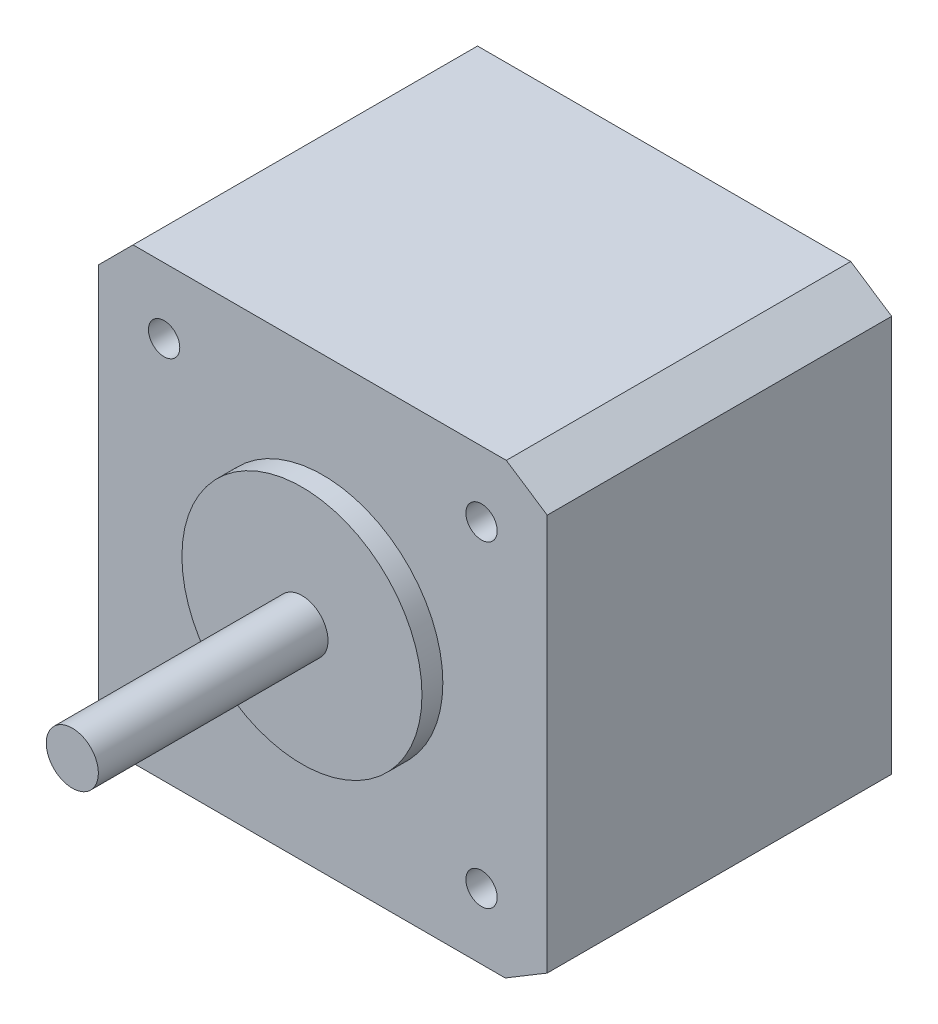
ISO-10303-21;
HEADER;
FILE_DESCRIPTION(('STEP AP214'),'2;1');
FILE_NAME('part.step','',(''),(''),'','','');
FILE_SCHEMA(('AUTOMOTIVE_DESIGN { 1 0 10303 214 1 1 1 1 }'));
ENDSEC;
DATA;
#1=APPLICATION_CONTEXT('core data for automotive mechanical design processes');
#2=APPLICATION_PROTOCOL_DEFINITION('international standard','automotive_design',2000,#1);
#3=PRODUCT_CONTEXT('',#1,'mechanical');
#4=PRODUCT('Part','Part','',(#3));
#5=PRODUCT_RELATED_PRODUCT_CATEGORY('part','',(#4));
#6=PRODUCT_DEFINITION_FORMATION('','',#4);
#7=PRODUCT_DEFINITION_CONTEXT('part definition',#1,'design');
#8=PRODUCT_DEFINITION('design','',#6,#7);
#9=PRODUCT_DEFINITION_SHAPE('','',#8);
#10=(LENGTH_UNIT() NAMED_UNIT(*) SI_UNIT(.MILLI.,.METRE.));
#11=(NAMED_UNIT(*) PLANE_ANGLE_UNIT() SI_UNIT($,.RADIAN.));
#12=(NAMED_UNIT(*) SI_UNIT($,.STERADIAN.) SOLID_ANGLE_UNIT());
#13=UNCERTAINTY_MEASURE_WITH_UNIT(LENGTH_MEASURE(1.E-05),#10,'distance_accuracy_value','');
#14=(GEOMETRIC_REPRESENTATION_CONTEXT(3) GLOBAL_UNCERTAINTY_ASSIGNED_CONTEXT((#13)) GLOBAL_UNIT_ASSIGNED_CONTEXT((#10,
#11,#12)) REPRESENTATION_CONTEXT('',''));
#15=CARTESIAN_POINT('',(0.,0.,0.));
#16=DIRECTION('',(0.,0.,1.));
#17=DIRECTION('',(1.,0.,0.));
#18=AXIS2_PLACEMENT_3D('',#15,#16,#17);
#19=CARTESIAN_POINT('',(-18.5054050318953,0.,33.));
#20=DIRECTION('',(1.,0.,0.));
#21=DIRECTION('',(0.,1.,0.));
#22=AXIS2_PLACEMENT_3D('',#19,#20,#21);
#23=PLANE('',#22);
#24=DIRECTION('',(0.,0.,-1.));
#25=VECTOR('',#24,1.);
#26=CARTESIAN_POINT('',(-18.5054050318953,8.03762715248077,7.));
#27=LINE('',#26,#25);
#28=CARTESIAN_POINT('',(-18.5054050318953,8.03762715248077,7.));
#29=VERTEX_POINT('',#28);
#30=CARTESIAN_POINT('',(-18.5054050318953,8.03762715248077,0.));
#31=VERTEX_POINT('',#30);
#32=EDGE_CURVE('E237',#29,#31,#27,.T.);
#33=ORIENTED_EDGE('',*,*,#32,.F.);
#34=DIRECTION('',(0.,-1.,0.));
#35=VECTOR('',#34,1.);
#36=CARTESIAN_POINT('',(-18.5054050318953,8.03762715248077,7.));
#37=LINE('',#36,#35);
#38=CARTESIAN_POINT('',(-18.5054050318953,-7.96312830467307,7.));
#39=VERTEX_POINT('',#38);
#40=EDGE_CURVE('E251',#29,#39,#37,.T.);
#41=ORIENTED_EDGE('',*,*,#40,.T.);
#42=DIRECTION('',(0.,0.,-1.));
#43=VECTOR('',#42,1.);
#44=CARTESIAN_POINT('',(-18.5054050318953,-7.96312830467307,7.));
#45=LINE('',#44,#43);
#46=CARTESIAN_POINT('',(-18.5054050318953,-7.96312830467307,0.));
#47=VERTEX_POINT('',#46);
#48=EDGE_CURVE('E238',#39,#47,#45,.T.);
#49=ORIENTED_EDGE('',*,*,#48,.T.);
#50=DIRECTION('',(0.,-1.,0.));
#51=VECTOR('',#50,1.);
#52=CARTESIAN_POINT('',(-18.5054050318953,0.,0.));
#53=LINE('',#52,#51);
#54=CARTESIAN_POINT('',(-18.5054050318953,-18.179246730528,0.));
#55=VERTEX_POINT('',#54);
#56=EDGE_CURVE('E185',#47,#55,#53,.T.);
#57=ORIENTED_EDGE('',*,*,#56,.T.);
#58=DIRECTION('',(0.,0.,-1.));
#59=VECTOR('',#58,1.);
#60=CARTESIAN_POINT('',(-18.5054050318953,-18.179246730528,33.));
#61=LINE('',#60,#59);
#62=CARTESIAN_POINT('',(-18.5054050318953,-18.179246730528,33.));
#63=VERTEX_POINT('',#62);
#64=EDGE_CURVE('E138',#63,#55,#61,.T.);
#65=ORIENTED_EDGE('',*,*,#64,.F.);
#66=DIRECTION('',(0.,-1.,0.));
#67=VECTOR('',#66,1.);
#68=CARTESIAN_POINT('',(-18.5054050318953,0.,33.));
#69=LINE('',#68,#67);
#70=CARTESIAN_POINT('',(-18.5054050318953,18.179246730528,33.));
#71=VERTEX_POINT('',#70);
#72=EDGE_CURVE('E141',#71,#63,#69,.T.);
#73=ORIENTED_EDGE('',*,*,#72,.F.);
#74=DIRECTION('',(0.,0.,-1.));
#75=VECTOR('',#74,1.);
#76=CARTESIAN_POINT('',(-18.5054050318953,18.179246730528,33.));
#77=LINE('',#76,#75);
#78=CARTESIAN_POINT('',(-18.5054050318953,18.179246730528,0.));
#79=VERTEX_POINT('',#78);
#80=EDGE_CURVE('E127',#71,#79,#77,.T.);
#81=ORIENTED_EDGE('',*,*,#80,.T.);
#82=EDGE_CURVE('E186',#79,#31,#53,.T.);
#83=ORIENTED_EDGE('',*,*,#82,.T.);
#84=EDGE_LOOP('',(#33,#41,#49,#57,#65,#73,#81,#83));
#85=FACE_BOUND('',#84,.T.);
#86=ADVANCED_FACE('F43',(#85),#23,.F.);
#87=CARTESIAN_POINT('',(0.,-21.5,33.));
#88=DIRECTION('',(0.,1.,0.));
#89=DIRECTION('',(0.,0.,1.));
#90=AXIS2_PLACEMENT_3D('',#87,#88,#89);
#91=PLANE('',#90);
#92=DIRECTION('',(1.,0.,0.));
#93=VECTOR('',#92,1.);
#94=CARTESIAN_POINT('',(0.,-21.5,0.));
#95=LINE('',#94,#93);
#96=CARTESIAN_POINT('',(-15.1846517624233,-21.5,0.));
#97=VERTEX_POINT('',#96);
#98=CARTESIAN_POINT('',(20.4701674614502,-21.5,0.));
#99=VERTEX_POINT('',#98);
#100=EDGE_CURVE('E169',#97,#99,#95,.T.);
#101=ORIENTED_EDGE('',*,*,#100,.T.);
#102=DIRECTION('',(0.,0.,-1.));
#103=VECTOR('',#102,1.);
#104=CARTESIAN_POINT('',(20.4701674614502,-21.5,33.));
#105=LINE('',#104,#103);
#106=CARTESIAN_POINT('',(20.4701674614502,-21.5,33.));
#107=VERTEX_POINT('',#106);
#108=EDGE_CURVE('E11',#107,#99,#105,.T.);
#109=ORIENTED_EDGE('',*,*,#108,.F.);
#110=DIRECTION('',(1.,0.,0.));
#111=VECTOR('',#110,1.);
#112=CARTESIAN_POINT('',(0.,-21.5,33.));
#113=LINE('',#112,#111);
#114=CARTESIAN_POINT('',(-15.1846517624233,-21.5,33.));
#115=VERTEX_POINT('',#114);
#116=EDGE_CURVE('E214',#115,#107,#113,.T.);
#117=ORIENTED_EDGE('',*,*,#116,.F.);
#118=DIRECTION('',(0.,0.,-1.));
#119=VECTOR('',#118,1.);
#120=CARTESIAN_POINT('',(-15.1846517624233,-21.5,33.));
#121=LINE('',#120,#119);
#122=EDGE_CURVE('E155',#115,#97,#121,.T.);
#123=ORIENTED_EDGE('',*,*,#122,.T.);
#124=EDGE_LOOP('',(#101,#109,#117,#123));
#125=FACE_BOUND('',#124,.T.);
#126=ADVANCED_FACE('F301',(#125),#91,.F.);
#127=CARTESIAN_POINT('',(14.933889450349,-24.8297962976807,33.));
#128=DIRECTION('',(-0.515409331767005,0.856944117622315,0.));
#129=DIRECTION('',(-0.856944117622315,-0.515409331767005,0.));
#130=AXIS2_PLACEMENT_3D('',#127,#128,#129);
#131=PLANE('',#130);
#132=DIRECTION('',(0.856944117622315,0.515409331767005,0.));
#133=VECTOR('',#132,1.);
#134=CARTESIAN_POINT('',(14.933889450349,-24.8297962976807,0.));
#135=LINE('',#134,#133);
#136=CARTESIAN_POINT('',(24.4945949681047,-19.0795067037688,0.));
#137=VERTEX_POINT('',#136);
#138=EDGE_CURVE('E172',#99,#137,#135,.T.);
#139=ORIENTED_EDGE('',*,*,#138,.T.);
#140=DIRECTION('',(0.,0.,-1.));
#141=VECTOR('',#140,1.);
#142=CARTESIAN_POINT('',(24.4945949681047,-19.0795067037688,33.));
#143=LINE('',#142,#141);
#144=CARTESIAN_POINT('',(24.4945949681047,-19.0795067037688,33.));
#145=VERTEX_POINT('',#144);
#146=EDGE_CURVE('E52',#145,#137,#143,.T.);
#147=ORIENTED_EDGE('',*,*,#146,.F.);
#148=DIRECTION('',(0.856944117622315,0.515409331767005,0.));
#149=VECTOR('',#148,1.);
#150=CARTESIAN_POINT('',(14.933889450349,-24.8297962976807,33.));
#151=LINE('',#150,#149);
#152=EDGE_CURVE('E109',#107,#145,#151,.T.);
#153=ORIENTED_EDGE('',*,*,#152,.F.);
#154=ORIENTED_EDGE('',*,*,#108,.T.);
#155=EDGE_LOOP('',(#139,#147,#153,#154));
#156=FACE_BOUND('',#155,.T.);
#157=ADVANCED_FACE('F203',(#156),#131,.F.);
#158=CARTESIAN_POINT('',(24.4945949681047,0.,33.));
#159=DIRECTION('',(1.,0.,0.));
#160=DIRECTION('',(0.,0.,-1.));
#161=AXIS2_PLACEMENT_3D('',#158,#159,#160);
#162=PLANE('',#161);
#163=DIRECTION('',(0.,-1.,0.));
#164=VECTOR('',#163,1.);
#165=CARTESIAN_POINT('',(24.4945949681047,0.,0.));
#166=LINE('',#165,#164);
#167=CARTESIAN_POINT('',(24.4945949681047,18.9156421060448,0.));
#168=VERTEX_POINT('',#167);
#169=EDGE_CURVE('E175',#168,#137,#166,.T.);
#170=ORIENTED_EDGE('',*,*,#169,.F.);
#171=DIRECTION('',(0.,0.,-1.));
#172=VECTOR('',#171,1.);
#173=CARTESIAN_POINT('',(24.4945949681047,18.9156421060448,33.));
#174=LINE('',#173,#172);
#175=CARTESIAN_POINT('',(24.4945949681047,18.9156421060448,33.));
#176=VERTEX_POINT('',#175);
#177=EDGE_CURVE('E195',#176,#168,#174,.T.);
#178=ORIENTED_EDGE('',*,*,#177,.F.);
#179=DIRECTION('',(0.,-1.,0.));
#180=VECTOR('',#179,1.);
#181=CARTESIAN_POINT('',(24.4945949681047,0.,33.));
#182=LINE('',#181,#180);
#183=EDGE_CURVE('E202',#176,#145,#182,.T.);
#184=ORIENTED_EDGE('',*,*,#183,.T.);
#185=ORIENTED_EDGE('',*,*,#146,.T.);
#186=EDGE_LOOP('',(#170,#178,#184,#185));
#187=FACE_BOUND('',#186,.T.);
#188=ADVANCED_FACE('F200',(#187),#162,.T.);
#189=CARTESIAN_POINT('',(16.1091739212586,24.4422324567986,33.));
#190=DIRECTION('',(0.550301947641926,0.834965727692762,0.));
#191=DIRECTION('',(-0.834965727692762,0.550301947641926,0.));
#192=AXIS2_PLACEMENT_3D('',#189,#190,#191);
#193=PLANE('',#192);
#194=DIRECTION('',(0.834965727692762,-0.550301947641926,0.));
#195=VECTOR('',#194,1.);
#196=CARTESIAN_POINT('',(16.1091739212586,24.4422324567986,0.));
#197=LINE('',#196,#195);
#198=CARTESIAN_POINT('',(20.5733835699053,21.5,0.));
#199=VERTEX_POINT('',#198);
#200=EDGE_CURVE('E178',#199,#168,#197,.T.);
#201=ORIENTED_EDGE('',*,*,#200,.F.);
#202=DIRECTION('',(0.,0.,-1.));
#203=VECTOR('',#202,1.);
#204=CARTESIAN_POINT('',(20.5733835699053,21.5,33.));
#205=LINE('',#204,#203);
#206=CARTESIAN_POINT('',(20.5733835699053,21.5,33.));
#207=VERTEX_POINT('',#206);
#208=EDGE_CURVE('E193',#207,#199,#205,.T.);
#209=ORIENTED_EDGE('',*,*,#208,.F.);
#210=DIRECTION('',(0.834965727692762,-0.550301947641926,0.));
#211=VECTOR('',#210,1.);
#212=CARTESIAN_POINT('',(16.1091739212586,24.4422324567986,33.));
#213=LINE('',#212,#211);
#214=EDGE_CURVE('E150',#207,#176,#213,.T.);
#215=ORIENTED_EDGE('',*,*,#214,.T.);
#216=ORIENTED_EDGE('',*,*,#177,.T.);
#217=EDGE_LOOP('',(#201,#209,#215,#216));
#218=FACE_BOUND('',#217,.T.);
#219=ADVANCED_FACE('F211',(#218),#193,.T.);
#220=CARTESIAN_POINT('',(0.,21.5,33.));
#221=DIRECTION('',(0.,1.,0.));
#222=DIRECTION('',(0.,0.,1.));
#223=AXIS2_PLACEMENT_3D('',#220,#221,#222);
#224=PLANE('',#223);
#225=DIRECTION('',(1.,0.,0.));
#226=VECTOR('',#225,1.);
#227=CARTESIAN_POINT('',(0.,21.5,0.));
#228=LINE('',#227,#226);
#229=CARTESIAN_POINT('',(-15.1846517624233,21.5,0.));
#230=VERTEX_POINT('',#229);
#231=EDGE_CURVE('E181',#230,#199,#228,.T.);
#232=ORIENTED_EDGE('',*,*,#231,.F.);
#233=DIRECTION('',(0.,0.,-1.));
#234=VECTOR('',#233,1.);
#235=CARTESIAN_POINT('',(-15.1846517624233,21.5,33.));
#236=LINE('',#235,#234);
#237=CARTESIAN_POINT('',(-15.1846517624233,21.5,33.));
#238=VERTEX_POINT('',#237);
#239=EDGE_CURVE('E137',#238,#230,#236,.T.);
#240=ORIENTED_EDGE('',*,*,#239,.F.);
#241=DIRECTION('',(1.,0.,0.));
#242=VECTOR('',#241,1.);
#243=CARTESIAN_POINT('',(0.,21.5,33.));
#244=LINE('',#243,#242);
#245=EDGE_CURVE('E148',#238,#207,#244,.T.);
#246=ORIENTED_EDGE('',*,*,#245,.T.);
#247=ORIENTED_EDGE('',*,*,#208,.T.);
#248=EDGE_LOOP('',(#232,#240,#246,#247));
#249=FACE_BOUND('',#248,.T.);
#250=ADVANCED_FACE('F317',(#249),#224,.T.);
#251=CARTESIAN_POINT('',(-18.3423258812116,18.3423258812116,33.));
#252=DIRECTION('',(-0.707106781186548,0.707106781186547,0.));
#253=DIRECTION('',(-0.707106781186547,-0.707106781186548,0.));
#254=AXIS2_PLACEMENT_3D('',#251,#252,#253);
#255=PLANE('',#254);
#256=DIRECTION('',(0.707106781186547,0.707106781186548,0.));
#257=VECTOR('',#256,1.);
#258=CARTESIAN_POINT('',(-18.3423258812116,18.3423258812116,0.));
#259=LINE('',#258,#257);
#260=EDGE_CURVE('E133',#79,#230,#259,.T.);
#261=ORIENTED_EDGE('',*,*,#260,.F.);
#262=ORIENTED_EDGE('',*,*,#80,.F.);
#263=DIRECTION('',(0.707106781186547,0.707106781186548,0.));
#264=VECTOR('',#263,1.);
#265=CARTESIAN_POINT('',(-18.3423258812116,18.3423258812116,33.));
#266=LINE('',#265,#264);
#267=EDGE_CURVE('E131',#71,#238,#266,.T.);
#268=ORIENTED_EDGE('',*,*,#267,.T.);
#269=ORIENTED_EDGE('',*,*,#239,.T.);
#270=EDGE_LOOP('',(#261,#262,#268,#269));
#271=FACE_BOUND('',#270,.T.);
#272=ADVANCED_FACE('F129',(#271),#255,.T.);
#273=CARTESIAN_POINT('',(-12.2112307989043,15.205825767009,33.));
#274=DIRECTION('',(0.,0.,-1.));
#275=DIRECTION('',(-1.,0.,0.));
#276=AXIS2_PLACEMENT_3D('',#273,#274,#275);
#277=CYLINDRICAL_SURFACE('',#276,1.5);
#278=CARTESIAN_POINT('',(-12.2112307989043,15.205825767009,33.));
#279=DIRECTION('',(0.,0.,1.));
#280=DIRECTION('',(1.,0.,0.));
#281=AXIS2_PLACEMENT_3D('',#278,#279,#280);
#282=CIRCLE('',#281,1.5);
#283=CARTESIAN_POINT('',(-10.7112307989043,15.205825767009,33.));
#284=VERTEX_POINT('',#283);
#285=EDGE_CURVE('E218',#284,#284,#282,.T.);
#286=ORIENTED_EDGE('',*,*,#285,.T.);
#287=EDGE_LOOP('',(#286));
#288=FACE_BOUND('',#287,.T.);
#289=CARTESIAN_POINT('',(-12.2112307989043,15.205825767009,0.));
#290=DIRECTION('',(0.,0.,1.));
#291=DIRECTION('',(1.,0.,0.));
#292=AXIS2_PLACEMENT_3D('',#289,#290,#291);
#293=CIRCLE('',#292,1.5);
#294=CARTESIAN_POINT('',(-10.7112307989043,15.205825767009,0.));
#295=VERTEX_POINT('',#294);
#296=EDGE_CURVE('E166',#295,#295,#293,.T.);
#297=ORIENTED_EDGE('',*,*,#296,.F.);
#298=EDGE_LOOP('',(#297));
#299=FACE_BOUND('',#298,.T.);
#300=ADVANCED_FACE('F316',(#288,#299),#277,.F.);
#301=CARTESIAN_POINT('',(18.2004207351138,15.205825767009,33.));
#302=DIRECTION('',(0.,0.,-1.));
#303=DIRECTION('',(-1.,0.,0.));
#304=AXIS2_PLACEMENT_3D('',#301,#302,#303);
#305=CYLINDRICAL_SURFACE('',#304,1.5);
#306=CARTESIAN_POINT('',(18.2004207351138,15.205825767009,33.));
#307=DIRECTION('',(0.,0.,1.));
#308=DIRECTION('',(1.,0.,0.));
#309=AXIS2_PLACEMENT_3D('',#306,#307,#308);
#310=CIRCLE('',#309,1.5);
#311=CARTESIAN_POINT('',(19.7004207351138,15.205825767009,33.));
#312=VERTEX_POINT('',#311);
#313=EDGE_CURVE('E221',#312,#312,#310,.T.);
#314=ORIENTED_EDGE('',*,*,#313,.T.);
#315=EDGE_LOOP('',(#314));
#316=FACE_BOUND('',#315,.T.);
#317=CARTESIAN_POINT('',(18.2004207351138,15.205825767009,0.));
#318=DIRECTION('',(0.,0.,1.));
#319=DIRECTION('',(1.,0.,0.));
#320=AXIS2_PLACEMENT_3D('',#317,#318,#319);
#321=CIRCLE('',#320,1.5);
#322=CARTESIAN_POINT('',(19.7004207351138,15.205825767009,0.));
#323=VERTEX_POINT('',#322);
#324=EDGE_CURVE('E163',#323,#323,#321,.T.);
#325=ORIENTED_EDGE('',*,*,#324,.F.);
#326=EDGE_LOOP('',(#325));
#327=FACE_BOUND('',#326,.T.);
#328=ADVANCED_FACE('F329',(#316,#327),#305,.F.);
#329=CARTESIAN_POINT('',(18.2004207351138,-15.205825767009,33.));
#330=DIRECTION('',(0.,0.,-1.));
#331=DIRECTION('',(-1.,0.,0.));
#332=AXIS2_PLACEMENT_3D('',#329,#330,#331);
#333=CYLINDRICAL_SURFACE('',#332,1.5);
#334=CARTESIAN_POINT('',(18.2004207351138,-15.205825767009,33.));
#335=DIRECTION('',(0.,0.,1.));
#336=DIRECTION('',(1.,0.,0.));
#337=AXIS2_PLACEMENT_3D('',#334,#335,#336);
#338=CIRCLE('',#337,1.5);
#339=CARTESIAN_POINT('',(19.7004207351138,-15.205825767009,33.));
#340=VERTEX_POINT('',#339);
#341=EDGE_CURVE('E224',#340,#340,#338,.T.);
#342=ORIENTED_EDGE('',*,*,#341,.T.);
#343=EDGE_LOOP('',(#342));
#344=FACE_BOUND('',#343,.T.);
#345=CARTESIAN_POINT('',(18.2004207351138,-15.205825767009,0.));
#346=DIRECTION('',(0.,0.,1.));
#347=DIRECTION('',(1.,0.,0.));
#348=AXIS2_PLACEMENT_3D('',#345,#346,#347);
#349=CIRCLE('',#348,1.5);
#350=CARTESIAN_POINT('',(19.7004207351138,-15.205825767009,0.));
#351=VERTEX_POINT('',#350);
#352=EDGE_CURVE('E159',#351,#351,#349,.T.);
#353=ORIENTED_EDGE('',*,*,#352,.F.);
#354=EDGE_LOOP('',(#353));
#355=FACE_BOUND('',#354,.T.);
#356=ADVANCED_FACE('F332',(#344,#355),#333,.F.);
#357=CARTESIAN_POINT('',(-12.2112307989043,-15.205825767009,33.));
#358=DIRECTION('',(0.,0.,-1.));
#359=DIRECTION('',(-1.,0.,0.));
#360=AXIS2_PLACEMENT_3D('',#357,#358,#359);
#361=CYLINDRICAL_SURFACE('',#360,1.5);
#362=CARTESIAN_POINT('',(-12.2112307989043,-15.205825767009,33.));
#363=DIRECTION('',(0.,0.,1.));
#364=DIRECTION('',(1.,0.,0.));
#365=AXIS2_PLACEMENT_3D('',#362,#363,#364);
#366=CIRCLE('',#365,1.5);
#367=CARTESIAN_POINT('',(-10.7112307989043,-15.205825767009,33.));
#368=VERTEX_POINT('',#367);
#369=EDGE_CURVE('E189',#368,#368,#366,.T.);
#370=ORIENTED_EDGE('',*,*,#369,.T.);
#371=EDGE_LOOP('',(#370));
#372=FACE_BOUND('',#371,.T.);
#373=CARTESIAN_POINT('',(-12.2112307989043,-15.205825767009,0.));
#374=DIRECTION('',(0.,0.,1.));
#375=DIRECTION('',(1.,0.,0.));
#376=AXIS2_PLACEMENT_3D('',#373,#374,#375);
#377=CIRCLE('',#376,1.5);
#378=CARTESIAN_POINT('',(-10.7112307989043,-15.205825767009,0.));
#379=VERTEX_POINT('',#378);
#380=EDGE_CURVE('E156',#379,#379,#377,.T.);
#381=ORIENTED_EDGE('',*,*,#380,.F.);
#382=EDGE_LOOP('',(#381));
#383=FACE_BOUND('',#382,.T.);
#384=ADVANCED_FACE('F45',(#372,#383),#361,.F.);
#385=CARTESIAN_POINT('',(-18.3423258812117,-18.3423258812116,33.));
#386=DIRECTION('',(0.707106781186549,0.707106781186546,0.));
#387=DIRECTION('',(-0.707106781186546,0.707106781186549,0.));
#388=AXIS2_PLACEMENT_3D('',#385,#386,#387);
#389=PLANE('',#388);
#390=DIRECTION('',(0.707106781186546,-0.707106781186549,0.));
#391=VECTOR('',#390,1.);
#392=CARTESIAN_POINT('',(-18.3423258812117,-18.3423258812116,0.));
#393=LINE('',#392,#391);
#394=EDGE_CURVE('E101',#55,#97,#393,.T.);
#395=ORIENTED_EDGE('',*,*,#394,.T.);
#396=ORIENTED_EDGE('',*,*,#122,.F.);
#397=DIRECTION('',(0.707106781186546,-0.707106781186549,0.));
#398=VECTOR('',#397,1.);
#399=CARTESIAN_POINT('',(-18.3423258812117,-18.3423258812116,33.));
#400=LINE('',#399,#398);
#401=EDGE_CURVE('E68',#63,#115,#400,.T.);
#402=ORIENTED_EDGE('',*,*,#401,.F.);
#403=ORIENTED_EDGE('',*,*,#64,.T.);
#404=EDGE_LOOP('',(#395,#396,#402,#403));
#405=FACE_BOUND('',#404,.T.);
#406=ADVANCED_FACE('F312',(#405),#389,.F.);
#407=CARTESIAN_POINT('',(0.,0.,33.));
#408=DIRECTION('',(0.,0.,1.));
#409=DIRECTION('',(1.,0.,0.));
#410=AXIS2_PLACEMENT_3D('',#407,#408,#409);
#411=PLANE('',#410);
#412=CARTESIAN_POINT('',(2.99459496810474,0.,33.));
#413=DIRECTION('',(0.,0.,1.));
#414=DIRECTION('',(1.,0.,0.));
#415=AXIS2_PLACEMENT_3D('',#412,#413,#414);
#416=CIRCLE('',#415,11.5);
#417=CARTESIAN_POINT('',(14.4945949681047,0.,33.));
#418=VERTEX_POINT('',#417);
#419=EDGE_CURVE('E160',#418,#418,#416,.F.);
#420=ORIENTED_EDGE('',*,*,#419,.T.);
#421=EDGE_LOOP('',(#420));
#422=FACE_BOUND('',#421,.T.);
#423=ORIENTED_EDGE('',*,*,#369,.F.);
#424=EDGE_LOOP('',(#423));
#425=FACE_BOUND('',#424,.T.);
#426=ORIENTED_EDGE('',*,*,#341,.F.);
#427=EDGE_LOOP('',(#426));
#428=FACE_BOUND('',#427,.T.);
#429=ORIENTED_EDGE('',*,*,#313,.F.);
#430=EDGE_LOOP('',(#429));
#431=FACE_BOUND('',#430,.T.);
#432=ORIENTED_EDGE('',*,*,#285,.F.);
#433=EDGE_LOOP('',(#432));
#434=FACE_BOUND('',#433,.T.);
#435=ORIENTED_EDGE('',*,*,#116,.T.);
#436=ORIENTED_EDGE('',*,*,#152,.T.);
#437=ORIENTED_EDGE('',*,*,#183,.F.);
#438=ORIENTED_EDGE('',*,*,#214,.F.);
#439=ORIENTED_EDGE('',*,*,#245,.F.);
#440=ORIENTED_EDGE('',*,*,#267,.F.);
#441=ORIENTED_EDGE('',*,*,#72,.T.);
#442=ORIENTED_EDGE('',*,*,#401,.T.);
#443=EDGE_LOOP('',(#435,#436,#437,#438,#439,#440,#441,#442));
#444=FACE_BOUND('',#443,.T.);
#445=ADVANCED_FACE('F145',(#422,#425,#428,#431,#434,#444),#411,.T.);
#446=CARTESIAN_POINT('',(0.,0.,0.));
#447=DIRECTION('',(0.,0.,1.));
#448=DIRECTION('',(1.,0.,0.));
#449=AXIS2_PLACEMENT_3D('',#446,#447,#448);
#450=PLANE('',#449);
#451=ORIENTED_EDGE('',*,*,#380,.T.);
#452=EDGE_LOOP('',(#451));
#453=FACE_BOUND('',#452,.T.);
#454=ORIENTED_EDGE('',*,*,#352,.T.);
#455=EDGE_LOOP('',(#454));
#456=FACE_BOUND('',#455,.T.);
#457=ORIENTED_EDGE('',*,*,#324,.T.);
#458=EDGE_LOOP('',(#457));
#459=FACE_BOUND('',#458,.T.);
#460=ORIENTED_EDGE('',*,*,#296,.T.);
#461=EDGE_LOOP('',(#460));
#462=FACE_BOUND('',#461,.T.);
#463=ORIENTED_EDGE('',*,*,#100,.F.);
#464=ORIENTED_EDGE('',*,*,#394,.F.);
#465=ORIENTED_EDGE('',*,*,#56,.F.);
#466=DIRECTION('',(-1.,0.,0.));
#467=VECTOR('',#466,1.);
#468=CARTESIAN_POINT('',(-18.5054050318953,-7.96312830467307,0.));
#469=LINE('',#468,#467);
#470=CARTESIAN_POINT('',(-23.9363238176737,-7.96312830467307,0.));
#471=VERTEX_POINT('',#470);
#472=EDGE_CURVE('E59',#47,#471,#469,.T.);
#473=ORIENTED_EDGE('',*,*,#472,.T.);
#474=DIRECTION('',(0.,-1.,0.));
#475=VECTOR('',#474,1.);
#476=CARTESIAN_POINT('',(-23.9363238176737,8.03762715248077,0.));
#477=LINE('',#476,#475);
#478=CARTESIAN_POINT('',(-23.9363238176737,8.03762715248077,0.));
#479=VERTEX_POINT('',#478);
#480=EDGE_CURVE('E252',#479,#471,#477,.T.);
#481=ORIENTED_EDGE('',*,*,#480,.F.);
#482=DIRECTION('',(-1.,0.,0.));
#483=VECTOR('',#482,1.);
#484=CARTESIAN_POINT('',(-18.5054050318953,8.03762715248077,0.));
#485=LINE('',#484,#483);
#486=EDGE_CURVE('E248',#31,#479,#485,.T.);
#487=ORIENTED_EDGE('',*,*,#486,.F.);
#488=ORIENTED_EDGE('',*,*,#82,.F.);
#489=ORIENTED_EDGE('',*,*,#260,.T.);
#490=ORIENTED_EDGE('',*,*,#231,.T.);
#491=ORIENTED_EDGE('',*,*,#200,.T.);
#492=ORIENTED_EDGE('',*,*,#169,.T.);
#493=ORIENTED_EDGE('',*,*,#138,.F.);
#494=EDGE_LOOP('',(#463,#464,#465,#473,#481,#487,#488,#489,#490,#491,#492,#493));
#495=FACE_BOUND('',#494,.T.);
#496=ADVANCED_FACE('F207',(#453,#456,#459,#462,#495),#450,.F.);
#497=CARTESIAN_POINT('',(2.99459496810474,0.,35.));
#498=DIRECTION('',(0.,0.,-1.));
#499=DIRECTION('',(-1.,0.,0.));
#500=AXIS2_PLACEMENT_3D('',#497,#498,#499);
#501=CYLINDRICAL_SURFACE('',#500,11.5);
#502=ORIENTED_EDGE('',*,*,#419,.F.);
#503=EDGE_LOOP('',(#502));
#504=FACE_BOUND('',#503,.T.);
#505=CARTESIAN_POINT('',(2.99459496810474,0.,35.));
#506=DIRECTION('',(0.,0.,1.));
#507=DIRECTION('',(1.,0.,0.));
#508=AXIS2_PLACEMENT_3D('',#505,#506,#507);
#509=CIRCLE('',#508,11.5);
#510=CARTESIAN_POINT('',(14.4945949681047,0.,35.));
#511=VERTEX_POINT('',#510);
#512=EDGE_CURVE('E231',#511,#511,#509,.T.);
#513=ORIENTED_EDGE('',*,*,#512,.F.);
#514=EDGE_LOOP('',(#513));
#515=FACE_BOUND('',#514,.T.);
#516=ADVANCED_FACE('F345',(#504,#515),#501,.T.);
#517=CARTESIAN_POINT('',(2.99459496810474,0.,35.));
#518=DIRECTION('',(0.,0.,1.));
#519=DIRECTION('',(1.,0.,0.));
#520=AXIS2_PLACEMENT_3D('',#517,#518,#519);
#521=PLANE('',#520);
#522=CARTESIAN_POINT('',(2.99459496810474,0.,35.));
#523=DIRECTION('',(0.,0.,1.));
#524=DIRECTION('',(1.,0.,0.));
#525=AXIS2_PLACEMENT_3D('',#522,#523,#524);
#526=CIRCLE('',#525,2.49550610533672);
#527=CARTESIAN_POINT('',(5.49010107344146,0.,35.));
#528=VERTEX_POINT('',#527);
#529=EDGE_CURVE('E47',#528,#528,#526,.F.);
#530=ORIENTED_EDGE('',*,*,#529,.T.);
#531=EDGE_LOOP('',(#530));
#532=FACE_BOUND('',#531,.T.);
#533=ORIENTED_EDGE('',*,*,#512,.T.);
#534=EDGE_LOOP('',(#533));
#535=FACE_BOUND('',#534,.T.);
#536=ADVANCED_FACE('F356',(#532,#535),#521,.T.);
#537=CARTESIAN_POINT('',(2.99459496810474,0.,57.));
#538=DIRECTION('',(0.,0.,-1.));
#539=DIRECTION('',(-1.,0.,0.));
#540=AXIS2_PLACEMENT_3D('',#537,#538,#539);
#541=CYLINDRICAL_SURFACE('',#540,2.49550610533672);
#542=ORIENTED_EDGE('',*,*,#529,.F.);
#543=EDGE_LOOP('',(#542));
#544=FACE_BOUND('',#543,.T.);
#545=CARTESIAN_POINT('',(2.99459496810474,0.,57.));
#546=DIRECTION('',(0.,0.,1.));
#547=DIRECTION('',(1.,0.,0.));
#548=AXIS2_PLACEMENT_3D('',#545,#546,#547);
#549=CIRCLE('',#548,2.49550610533672);
#550=CARTESIAN_POINT('',(5.49010107344146,0.,57.));
#551=VERTEX_POINT('',#550);
#552=EDGE_CURVE('E234',#551,#551,#549,.T.);
#553=ORIENTED_EDGE('',*,*,#552,.F.);
#554=EDGE_LOOP('',(#553));
#555=FACE_BOUND('',#554,.T.);
#556=ADVANCED_FACE('F365',(#544,#555),#541,.T.);
#557=CARTESIAN_POINT('',(2.99459496810474,0.,57.));
#558=DIRECTION('',(0.,0.,1.));
#559=DIRECTION('',(1.,0.,0.));
#560=AXIS2_PLACEMENT_3D('',#557,#558,#559);
#561=PLANE('',#560);
#562=ORIENTED_EDGE('',*,*,#552,.T.);
#563=EDGE_LOOP('',(#562));
#564=FACE_BOUND('',#563,.T.);
#565=ADVANCED_FACE('F368',(#564),#561,.T.);
#566=CARTESIAN_POINT('',(-18.5054050318953,8.03762715248077,7.));
#567=DIRECTION('',(0.,-1.,0.));
#568=DIRECTION('',(0.,0.,-1.));
#569=AXIS2_PLACEMENT_3D('',#566,#567,#568);
#570=PLANE('',#569);
#571=ORIENTED_EDGE('',*,*,#486,.T.);
#572=DIRECTION('',(0.,0.,-1.));
#573=VECTOR('',#572,1.);
#574=CARTESIAN_POINT('',(-23.9363238176737,8.03762715248077,7.));
#575=LINE('',#574,#573);
#576=CARTESIAN_POINT('',(-23.9363238176737,8.03762715248077,7.));
#577=VERTEX_POINT('',#576);
#578=EDGE_CURVE('E243',#577,#479,#575,.T.);
#579=ORIENTED_EDGE('',*,*,#578,.F.);
#580=DIRECTION('',(-1.,0.,0.));
#581=VECTOR('',#580,1.);
#582=CARTESIAN_POINT('',(-18.5054050318953,8.03762715248077,7.));
#583=LINE('',#582,#581);
#584=EDGE_CURVE('E241',#29,#577,#583,.T.);
#585=ORIENTED_EDGE('',*,*,#584,.F.);
#586=ORIENTED_EDGE('',*,*,#32,.T.);
#587=EDGE_LOOP('',(#571,#579,#585,#586));
#588=FACE_BOUND('',#587,.T.);
#589=ADVANCED_FACE('F284',(#588),#570,.F.);
#590=CARTESIAN_POINT('',(-23.9363238176737,8.03762715248077,7.));
#591=DIRECTION('',(1.,0.,0.));
#592=DIRECTION('',(0.,0.,-1.));
#593=AXIS2_PLACEMENT_3D('',#590,#591,#592);
#594=PLANE('',#593);
#595=ORIENTED_EDGE('',*,*,#480,.T.);
#596=DIRECTION('',(0.,0.,-1.));
#597=VECTOR('',#596,1.);
#598=CARTESIAN_POINT('',(-23.9363238176737,-7.96312830467307,7.));
#599=LINE('',#598,#597);
#600=CARTESIAN_POINT('',(-23.9363238176737,-7.96312830467307,7.));
#601=VERTEX_POINT('',#600);
#602=EDGE_CURVE('E240',#601,#471,#599,.T.);
#603=ORIENTED_EDGE('',*,*,#602,.F.);
#604=DIRECTION('',(0.,-1.,0.));
#605=VECTOR('',#604,1.);
#606=CARTESIAN_POINT('',(-23.9363238176737,8.03762715248077,7.));
#607=LINE('',#606,#605);
#608=EDGE_CURVE('E258',#577,#601,#607,.T.);
#609=ORIENTED_EDGE('',*,*,#608,.F.);
#610=ORIENTED_EDGE('',*,*,#578,.T.);
#611=EDGE_LOOP('',(#595,#603,#609,#610));
#612=FACE_BOUND('',#611,.T.);
#613=ADVANCED_FACE('F288',(#612),#594,.F.);
#614=CARTESIAN_POINT('',(-18.5054050318953,-7.96312830467307,7.));
#615=DIRECTION('',(0.,-1.,0.));
#616=DIRECTION('',(0.,0.,-1.));
#617=AXIS2_PLACEMENT_3D('',#614,#615,#616);
#618=PLANE('',#617);
#619=ORIENTED_EDGE('',*,*,#472,.F.);
#620=ORIENTED_EDGE('',*,*,#48,.F.);
#621=DIRECTION('',(-1.,0.,0.));
#622=VECTOR('',#621,1.);
#623=CARTESIAN_POINT('',(-18.5054050318953,-7.96312830467307,7.));
#624=LINE('',#623,#622);
#625=EDGE_CURVE('E261',#39,#601,#624,.T.);
#626=ORIENTED_EDGE('',*,*,#625,.T.);
#627=ORIENTED_EDGE('',*,*,#602,.T.);
#628=EDGE_LOOP('',(#619,#620,#626,#627));
#629=FACE_BOUND('',#628,.T.);
#630=ADVANCED_FACE('F290',(#629),#618,.T.);
#631=CARTESIAN_POINT('',(0.,0.,7.));
#632=DIRECTION('',(0.,0.,-1.));
#633=DIRECTION('',(-1.,0.,0.));
#634=AXIS2_PLACEMENT_3D('',#631,#632,#633);
#635=PLANE('',#634);
#636=ORIENTED_EDGE('',*,*,#40,.F.);
#637=ORIENTED_EDGE('',*,*,#584,.T.);
#638=ORIENTED_EDGE('',*,*,#608,.T.);
#639=ORIENTED_EDGE('',*,*,#625,.F.);
#640=EDGE_LOOP('',(#636,#637,#638,#639));
#641=FACE_BOUND('',#640,.T.);
#642=ADVANCED_FACE('F272',(#641),#635,.F.);
#643=CLOSED_SHELL('',(#86,#126,#157,#188,#219,#250,#272,#300,#328,#356,#384,#406,#445,#496,#516,
#536,#556,#565,#589,#613,#630,#642));
#644=MANIFOLD_SOLID_BREP('B2',#643);
#645=ADVANCED_BREP_SHAPE_REPRESENTATION('',(#18,#644),#14);
#646=SHAPE_DEFINITION_REPRESENTATION(#9,#645);
ENDSEC;
END-ISO-10303-21;
